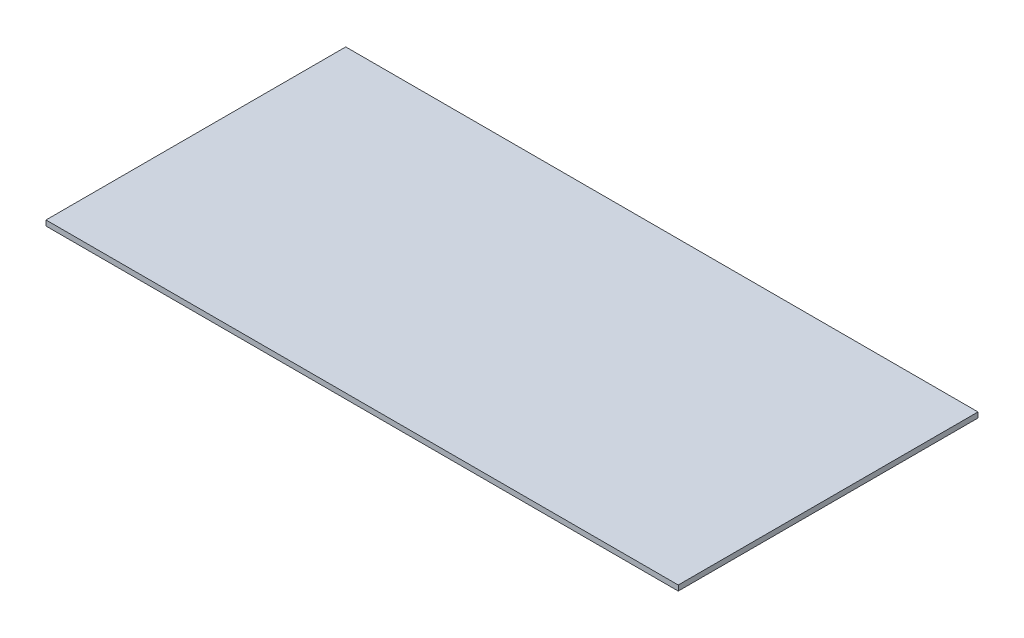
ISO-10303-21;
HEADER;
FILE_DESCRIPTION(('STEP AP214'),'2;1');
FILE_NAME('part.step','',(''),(''),'','','');
FILE_SCHEMA(('AUTOMOTIVE_DESIGN { 1 0 10303 214 1 1 1 1 }'));
ENDSEC;
DATA;
#1=APPLICATION_CONTEXT('core data for automotive mechanical design processes');
#2=APPLICATION_PROTOCOL_DEFINITION('international standard','automotive_design',2000,#1);
#3=PRODUCT_CONTEXT('',#1,'mechanical');
#4=PRODUCT('Part','Part','',(#3));
#5=PRODUCT_RELATED_PRODUCT_CATEGORY('part','',(#4));
#6=PRODUCT_DEFINITION_FORMATION('','',#4);
#7=PRODUCT_DEFINITION_CONTEXT('part definition',#1,'design');
#8=PRODUCT_DEFINITION('design','',#6,#7);
#9=PRODUCT_DEFINITION_SHAPE('','',#8);
#10=(LENGTH_UNIT() NAMED_UNIT(*) SI_UNIT(.MILLI.,.METRE.));
#11=(NAMED_UNIT(*) PLANE_ANGLE_UNIT() SI_UNIT($,.RADIAN.));
#12=(NAMED_UNIT(*) SI_UNIT($,.STERADIAN.) SOLID_ANGLE_UNIT());
#13=UNCERTAINTY_MEASURE_WITH_UNIT(LENGTH_MEASURE(1.E-05),#10,'distance_accuracy_value','');
#14=(GEOMETRIC_REPRESENTATION_CONTEXT(3) GLOBAL_UNCERTAINTY_ASSIGNED_CONTEXT((#13)) GLOBAL_UNIT_ASSIGNED_CONTEXT((#10,
#11,#12)) REPRESENTATION_CONTEXT('',''));
#15=CARTESIAN_POINT('',(0.,0.,0.));
#16=DIRECTION('',(0.,0.,1.));
#17=DIRECTION('',(1.,0.,0.));
#18=AXIS2_PLACEMENT_3D('',#15,#16,#17);
#19=CARTESIAN_POINT('',(-321.5,1096.,1557.));
#20=DIRECTION('',(0.,-1.,0.));
#21=DIRECTION('',(1.,0.,0.));
#22=AXIS2_PLACEMENT_3D('',#19,#20,#21);
#23=PLANE('',#22);
#24=DIRECTION('',(-1.,0.,0.));
#25=VECTOR('',#24,1.);
#26=CARTESIAN_POINT('',(634.,1096.,2010.));
#27=LINE('',#26,#25);
#28=CARTESIAN_POINT('',(634.,1096.,2010.));
#29=VERTEX_POINT('',#28);
#30=CARTESIAN_POINT('',(-1277.,1096.,2010.));
#31=VERTEX_POINT('',#30);
#32=EDGE_CURVE('E79',#29,#31,#27,.T.);
#33=ORIENTED_EDGE('',*,*,#32,.F.);
#34=DIRECTION('',(0.,0.,1.));
#35=VECTOR('',#34,1.);
#36=CARTESIAN_POINT('',(634.,1096.,1104.));
#37=LINE('',#36,#35);
#38=CARTESIAN_POINT('',(634.,1096.,1104.));
#39=VERTEX_POINT('',#38);
#40=EDGE_CURVE('E35',#39,#29,#37,.T.);
#41=ORIENTED_EDGE('',*,*,#40,.F.);
#42=DIRECTION('',(1.,0.,0.));
#43=VECTOR('',#42,1.);
#44=CARTESIAN_POINT('',(-1277.,1096.,1104.));
#45=LINE('',#44,#43);
#46=CARTESIAN_POINT('',(-1277.,1096.,1104.));
#47=VERTEX_POINT('',#46);
#48=EDGE_CURVE('E56',#47,#39,#45,.T.);
#49=ORIENTED_EDGE('',*,*,#48,.F.);
#50=DIRECTION('',(0.,0.,-1.));
#51=VECTOR('',#50,1.);
#52=CARTESIAN_POINT('',(-1277.,1096.,2010.));
#53=LINE('',#52,#51);
#54=EDGE_CURVE('E27',#31,#47,#53,.T.);
#55=ORIENTED_EDGE('',*,*,#54,.F.);
#56=EDGE_LOOP('',(#33,#41,#49,#55));
#57=FACE_BOUND('',#56,.T.);
#58=ADVANCED_FACE('F17',(#57),#23,.F.);
#59=CARTESIAN_POINT('',(-1277.,1096.,2010.));
#60=DIRECTION('',(-1.,0.,0.));
#61=DIRECTION('',(0.,-1.,0.));
#62=AXIS2_PLACEMENT_3D('',#59,#60,#61);
#63=PLANE('',#62);
#64=DIRECTION('',(0.,-1.,0.));
#65=VECTOR('',#64,1.);
#66=CARTESIAN_POINT('',(-1277.,1096.,1104.));
#67=LINE('',#66,#65);
#68=CARTESIAN_POINT('',(-1277.,1080.,1104.));
#69=VERTEX_POINT('',#68);
#70=EDGE_CURVE('E11',#47,#69,#67,.T.);
#71=ORIENTED_EDGE('',*,*,#70,.T.);
#72=DIRECTION('',(0.,0.,-1.));
#73=VECTOR('',#72,1.);
#74=CARTESIAN_POINT('',(-1277.,1080.,2010.));
#75=LINE('',#74,#73);
#76=CARTESIAN_POINT('',(-1277.,1080.,2010.));
#77=VERTEX_POINT('',#76);
#78=EDGE_CURVE('E82',#77,#69,#75,.T.);
#79=ORIENTED_EDGE('',*,*,#78,.F.);
#80=DIRECTION('',(0.,-1.,0.));
#81=VECTOR('',#80,1.);
#82=CARTESIAN_POINT('',(-1277.,1096.,2010.));
#83=LINE('',#82,#81);
#84=EDGE_CURVE('E68',#31,#77,#83,.T.);
#85=ORIENTED_EDGE('',*,*,#84,.F.);
#86=ORIENTED_EDGE('',*,*,#54,.T.);
#87=EDGE_LOOP('',(#71,#79,#85,#86));
#88=FACE_BOUND('',#87,.T.);
#89=ADVANCED_FACE('F19',(#88),#63,.T.);
#90=CARTESIAN_POINT('',(634.,1096.,2010.));
#91=DIRECTION('',(0.,0.,1.));
#92=DIRECTION('',(1.,0.,0.));
#93=AXIS2_PLACEMENT_3D('',#90,#91,#92);
#94=PLANE('',#93);
#95=ORIENTED_EDGE('',*,*,#84,.T.);
#96=DIRECTION('',(-1.,0.,0.));
#97=VECTOR('',#96,1.);
#98=CARTESIAN_POINT('',(634.,1080.,2010.));
#99=LINE('',#98,#97);
#100=CARTESIAN_POINT('',(634.,1080.,2010.));
#101=VERTEX_POINT('',#100);
#102=EDGE_CURVE('E21',#101,#77,#99,.T.);
#103=ORIENTED_EDGE('',*,*,#102,.F.);
#104=DIRECTION('',(0.,-1.,0.));
#105=VECTOR('',#104,1.);
#106=CARTESIAN_POINT('',(634.,1096.,2010.));
#107=LINE('',#106,#105);
#108=EDGE_CURVE('E80',#29,#101,#107,.T.);
#109=ORIENTED_EDGE('',*,*,#108,.F.);
#110=ORIENTED_EDGE('',*,*,#32,.T.);
#111=EDGE_LOOP('',(#95,#103,#109,#110));
#112=FACE_BOUND('',#111,.T.);
#113=ADVANCED_FACE('F88',(#112),#94,.T.);
#114=CARTESIAN_POINT('',(634.,1096.,1104.));
#115=DIRECTION('',(1.,0.,0.));
#116=DIRECTION('',(0.,0.,1.));
#117=AXIS2_PLACEMENT_3D('',#114,#115,#116);
#118=PLANE('',#117);
#119=ORIENTED_EDGE('',*,*,#108,.T.);
#120=DIRECTION('',(0.,0.,1.));
#121=VECTOR('',#120,1.);
#122=CARTESIAN_POINT('',(634.,1080.,1104.));
#123=LINE('',#122,#121);
#124=CARTESIAN_POINT('',(634.,1080.,1104.));
#125=VERTEX_POINT('',#124);
#126=EDGE_CURVE('E74',#125,#101,#123,.T.);
#127=ORIENTED_EDGE('',*,*,#126,.F.);
#128=DIRECTION('',(0.,-1.,0.));
#129=VECTOR('',#128,1.);
#130=CARTESIAN_POINT('',(634.,1096.,1104.));
#131=LINE('',#130,#129);
#132=EDGE_CURVE('E62',#39,#125,#131,.T.);
#133=ORIENTED_EDGE('',*,*,#132,.F.);
#134=ORIENTED_EDGE('',*,*,#40,.T.);
#135=EDGE_LOOP('',(#119,#127,#133,#134));
#136=FACE_BOUND('',#135,.T.);
#137=ADVANCED_FACE('F89',(#136),#118,.T.);
#138=CARTESIAN_POINT('',(-1277.,1096.,1104.));
#139=DIRECTION('',(0.,0.,-1.));
#140=DIRECTION('',(0.,1.,0.));
#141=AXIS2_PLACEMENT_3D('',#138,#139,#140);
#142=PLANE('',#141);
#143=ORIENTED_EDGE('',*,*,#132,.T.);
#144=DIRECTION('',(1.,0.,0.));
#145=VECTOR('',#144,1.);
#146=CARTESIAN_POINT('',(-1277.,1080.,1104.));
#147=LINE('',#146,#145);
#148=EDGE_CURVE('E63',#69,#125,#147,.T.);
#149=ORIENTED_EDGE('',*,*,#148,.F.);
#150=ORIENTED_EDGE('',*,*,#70,.F.);
#151=ORIENTED_EDGE('',*,*,#48,.T.);
#152=EDGE_LOOP('',(#143,#149,#150,#151));
#153=FACE_BOUND('',#152,.T.);
#154=ADVANCED_FACE('F70',(#153),#142,.T.);
#155=CARTESIAN_POINT('',(-321.5,1080.,1557.));
#156=DIRECTION('',(0.,-1.,0.));
#157=DIRECTION('',(1.,0.,0.));
#158=AXIS2_PLACEMENT_3D('',#155,#156,#157);
#159=PLANE('',#158);
#160=ORIENTED_EDGE('',*,*,#148,.T.);
#161=ORIENTED_EDGE('',*,*,#126,.T.);
#162=ORIENTED_EDGE('',*,*,#102,.T.);
#163=ORIENTED_EDGE('',*,*,#78,.T.);
#164=EDGE_LOOP('',(#160,#161,#162,#163));
#165=FACE_BOUND('',#164,.T.);
#166=ADVANCED_FACE('F84',(#165),#159,.T.);
#167=CLOSED_SHELL('',(#58,#89,#113,#137,#154,#166));
#168=MANIFOLD_SOLID_BREP('B1',#167);
#169=ADVANCED_BREP_SHAPE_REPRESENTATION('',(#18,#168),#14);
#170=SHAPE_DEFINITION_REPRESENTATION(#9,#169);
ENDSEC;
END-ISO-10303-21;
